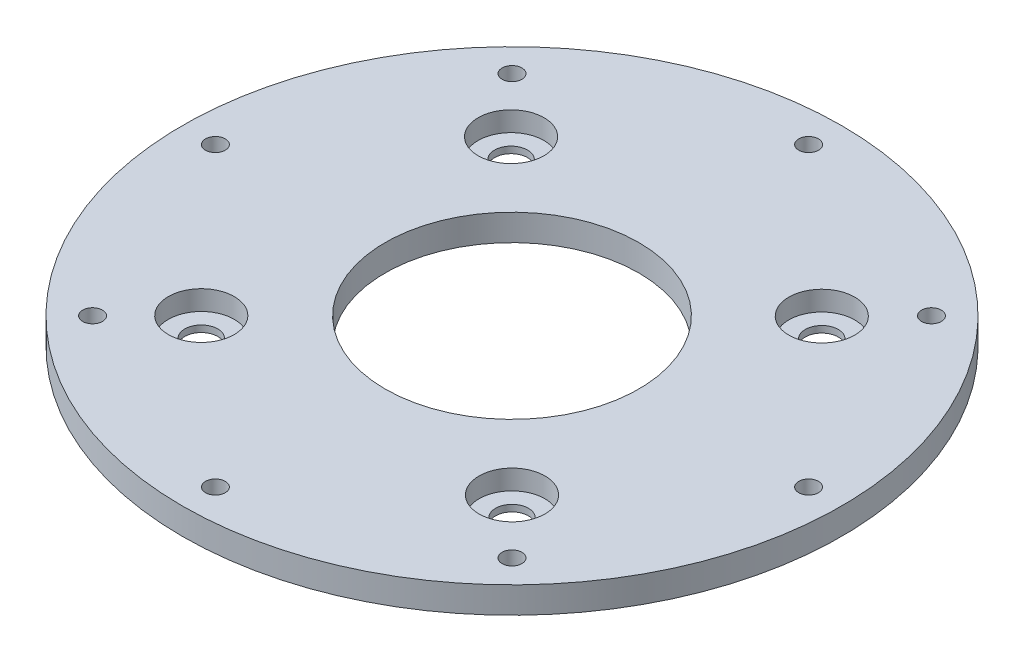
ISO-10303-21;
HEADER;
FILE_DESCRIPTION(('STEP AP214'),'2;1');
FILE_NAME('part.step','',(''),(''),'','','');
FILE_SCHEMA(('AUTOMOTIVE_DESIGN { 1 0 10303 214 1 1 1 1 }'));
ENDSEC;
DATA;
#1=APPLICATION_CONTEXT('core data for automotive mechanical design processes');
#2=APPLICATION_PROTOCOL_DEFINITION('international standard','automotive_design',2000,#1);
#3=PRODUCT_CONTEXT('',#1,'mechanical');
#4=PRODUCT('Part','Part','',(#3));
#5=PRODUCT_RELATED_PRODUCT_CATEGORY('part','',(#4));
#6=PRODUCT_DEFINITION_FORMATION('','',#4);
#7=PRODUCT_DEFINITION_CONTEXT('part definition',#1,'design');
#8=PRODUCT_DEFINITION('design','',#6,#7);
#9=PRODUCT_DEFINITION_SHAPE('','',#8);
#10=(LENGTH_UNIT() NAMED_UNIT(*) SI_UNIT(.MILLI.,.METRE.));
#11=(NAMED_UNIT(*) PLANE_ANGLE_UNIT() SI_UNIT($,.RADIAN.));
#12=(NAMED_UNIT(*) SI_UNIT($,.STERADIAN.) SOLID_ANGLE_UNIT());
#13=UNCERTAINTY_MEASURE_WITH_UNIT(LENGTH_MEASURE(1.E-05),#10,'distance_accuracy_value','');
#14=(GEOMETRIC_REPRESENTATION_CONTEXT(3) GLOBAL_UNCERTAINTY_ASSIGNED_CONTEXT((#13)) GLOBAL_UNIT_ASSIGNED_CONTEXT((#10,
#11,#12)) REPRESENTATION_CONTEXT('',''));
#15=CARTESIAN_POINT('',(0.,0.,0.));
#16=DIRECTION('',(0.,0.,1.));
#17=DIRECTION('',(1.,0.,0.));
#18=AXIS2_PLACEMENT_3D('',#15,#16,#17);
#19=CARTESIAN_POINT('',(23.5424997013851,81.0000000000003,28.5417867616985));
#20=DIRECTION('',(0.,1.,0.));
#21=DIRECTION('',(0.,0.,1.));
#22=AXIS2_PLACEMENT_3D('',#19,#20,#21);
#23=CYLINDRICAL_SURFACE('',#22,5.);
#24=CARTESIAN_POINT('',(23.5424997013851,64.0000000000003,28.5417867616985));
#25=DIRECTION('',(0.,1.,0.));
#26=DIRECTION('',(0.,0.,1.));
#27=AXIS2_PLACEMENT_3D('',#24,#25,#26);
#28=CIRCLE('',#27,5.);
#29=CARTESIAN_POINT('',(23.5424997013851,64.0000000000003,33.5417867616985));
#30=VERTEX_POINT('',#29);
#31=EDGE_CURVE('E116',#30,#30,#28,.F.);
#32=ORIENTED_EDGE('',*,*,#31,.F.);
#33=EDGE_LOOP('',(#32));
#34=FACE_BOUND('',#33,.T.);
#35=CARTESIAN_POINT('',(23.5424997013851,61.0000000000003,28.5417867616985));
#36=DIRECTION('',(0.,1.,0.));
#37=DIRECTION('',(0.,0.,1.));
#38=AXIS2_PLACEMENT_3D('',#35,#36,#37);
#39=CIRCLE('',#38,5.);
#40=CARTESIAN_POINT('',(23.5424997013851,61.0000000000003,33.5417867616985));
#41=VERTEX_POINT('',#40);
#42=EDGE_CURVE('E18',#41,#41,#39,.T.);
#43=ORIENTED_EDGE('',*,*,#42,.F.);
#44=EDGE_LOOP('',(#43));
#45=FACE_BOUND('',#44,.T.);
#46=ADVANCED_FACE('F15',(#34,#45),#23,.F.);
#47=CARTESIAN_POINT('',(-23.5997520125237,81.0000000000004,28.5417867616985));
#48=DIRECTION('',(0.,1.,0.));
#49=DIRECTION('',(0.,0.,1.));
#50=AXIS2_PLACEMENT_3D('',#47,#48,#49);
#51=CYLINDRICAL_SURFACE('',#50,5.);
#52=CARTESIAN_POINT('',(-23.5997520125237,64.0000000000004,28.5417867616985));
#53=DIRECTION('',(0.,1.,0.));
#54=DIRECTION('',(0.,0.,1.));
#55=AXIS2_PLACEMENT_3D('',#52,#53,#54);
#56=CIRCLE('',#55,5.);
#57=CARTESIAN_POINT('',(-23.5997520125237,64.0000000000004,33.5417867616985));
#58=VERTEX_POINT('',#57);
#59=EDGE_CURVE('E113',#58,#58,#56,.F.);
#60=ORIENTED_EDGE('',*,*,#59,.F.);
#61=EDGE_LOOP('',(#60));
#62=FACE_BOUND('',#61,.T.);
#63=CARTESIAN_POINT('',(-23.5997520125237,61.0000000000004,28.5417867616985));
#64=DIRECTION('',(0.,1.,0.));
#65=DIRECTION('',(0.,0.,1.));
#66=AXIS2_PLACEMENT_3D('',#63,#64,#65);
#67=CIRCLE('',#66,5.);
#68=CARTESIAN_POINT('',(-23.5997520125237,61.0000000000004,33.5417867616985));
#69=VERTEX_POINT('',#68);
#70=EDGE_CURVE('E124',#69,#69,#67,.T.);
#71=ORIENTED_EDGE('',*,*,#70,.F.);
#72=EDGE_LOOP('',(#71));
#73=FACE_BOUND('',#72,.T.);
#74=ADVANCED_FACE('F135',(#62,#73),#51,.F.);
#75=CARTESIAN_POINT('',(-23.5997520125236,81.0000000000005,-18.4582132383015));
#76=DIRECTION('',(0.,1.,0.));
#77=DIRECTION('',(0.,0.,1.));
#78=AXIS2_PLACEMENT_3D('',#75,#76,#77);
#79=CYLINDRICAL_SURFACE('',#78,5.);
#80=CARTESIAN_POINT('',(-23.5997520125236,64.0000000000004,-18.4582132383015));
#81=DIRECTION('',(0.,1.,0.));
#82=DIRECTION('',(0.,0.,1.));
#83=AXIS2_PLACEMENT_3D('',#80,#81,#82);
#84=CIRCLE('',#83,5.);
#85=CARTESIAN_POINT('',(-23.5997520125236,64.0000000000004,-13.4582132383015));
#86=VERTEX_POINT('',#85);
#87=EDGE_CURVE('E110',#86,#86,#84,.F.);
#88=ORIENTED_EDGE('',*,*,#87,.F.);
#89=EDGE_LOOP('',(#88));
#90=FACE_BOUND('',#89,.T.);
#91=CARTESIAN_POINT('',(-23.5997520125236,61.0000000000005,-18.4582132383015));
#92=DIRECTION('',(0.,1.,0.));
#93=DIRECTION('',(0.,0.,1.));
#94=AXIS2_PLACEMENT_3D('',#91,#92,#93);
#95=CIRCLE('',#94,5.);
#96=CARTESIAN_POINT('',(-23.5997520125236,61.0000000000005,-13.4582132383015));
#97=VERTEX_POINT('',#96);
#98=EDGE_CURVE('E122',#97,#97,#95,.T.);
#99=ORIENTED_EDGE('',*,*,#98,.F.);
#100=EDGE_LOOP('',(#99));
#101=FACE_BOUND('',#100,.T.);
#102=ADVANCED_FACE('F141',(#90,#101),#79,.F.);
#103=CARTESIAN_POINT('',(23.542499701385,81.0000000000003,-18.4582132383015));
#104=DIRECTION('',(0.,1.,0.));
#105=DIRECTION('',(0.,0.,1.));
#106=AXIS2_PLACEMENT_3D('',#103,#104,#105);
#107=CYLINDRICAL_SURFACE('',#106,5.);
#108=CARTESIAN_POINT('',(23.542499701385,64.0000000000003,-18.4582132383015));
#109=DIRECTION('',(0.,1.,0.));
#110=DIRECTION('',(0.,0.,1.));
#111=AXIS2_PLACEMENT_3D('',#108,#109,#110);
#112=CIRCLE('',#111,5.);
#113=CARTESIAN_POINT('',(23.542499701385,64.0000000000003,-13.4582132383015));
#114=VERTEX_POINT('',#113);
#115=EDGE_CURVE('E107',#114,#114,#112,.F.);
#116=ORIENTED_EDGE('',*,*,#115,.F.);
#117=EDGE_LOOP('',(#116));
#118=FACE_BOUND('',#117,.T.);
#119=CARTESIAN_POINT('',(23.542499701385,61.0000000000003,-18.4582132383015));
#120=DIRECTION('',(0.,1.,0.));
#121=DIRECTION('',(0.,0.,1.));
#122=AXIS2_PLACEMENT_3D('',#119,#120,#121);
#123=CIRCLE('',#122,5.);
#124=CARTESIAN_POINT('',(23.542499701385,61.0000000000003,-13.4582132383015));
#125=VERTEX_POINT('',#124);
#126=EDGE_CURVE('E119',#125,#125,#123,.T.);
#127=ORIENTED_EDGE('',*,*,#126,.F.);
#128=EDGE_LOOP('',(#127));
#129=FACE_BOUND('',#128,.T.);
#130=ADVANCED_FACE('F224',(#118,#129),#107,.F.);
#131=CARTESIAN_POINT('',(28.6424997013851,61.0000000000003,23.4417867616985));
#132=DIRECTION('',(0.,1.,0.));
#133=DIRECTION('',(0.,0.,1.));
#134=AXIS2_PLACEMENT_3D('',#131,#132,#133);
#135=PLANE('',#134);
#136=ORIENTED_EDGE('',*,*,#42,.T.);
#137=EDGE_LOOP('',(#136));
#138=FACE_BOUND('',#137,.T.);
#139=CARTESIAN_POINT('',(23.5424997013851,61.0000000000003,28.5417867616985));
#140=DIRECTION('',(0.,1.,0.));
#141=DIRECTION('',(0.,0.,1.));
#142=AXIS2_PLACEMENT_3D('',#139,#140,#141);
#143=CIRCLE('',#142,2.5);
#144=CARTESIAN_POINT('',(23.5424997013851,61.0000000000003,31.0417867616985));
#145=VERTEX_POINT('',#144);
#146=EDGE_CURVE('E92',#145,#145,#143,.F.);
#147=ORIENTED_EDGE('',*,*,#146,.T.);
#148=EDGE_LOOP('',(#147));
#149=FACE_BOUND('',#148,.T.);
#150=ADVANCED_FACE('F131',(#138,#149),#135,.T.);
#151=CARTESIAN_POINT('',(-18.4997520125237,61.0000000000004,23.4417867616985));
#152=DIRECTION('',(0.,1.,0.));
#153=DIRECTION('',(0.,0.,1.));
#154=AXIS2_PLACEMENT_3D('',#151,#152,#153);
#155=PLANE('',#154);
#156=ORIENTED_EDGE('',*,*,#70,.T.);
#157=EDGE_LOOP('',(#156));
#158=FACE_BOUND('',#157,.T.);
#159=CARTESIAN_POINT('',(-23.5997520125237,61.0000000000004,28.5417867616985));
#160=DIRECTION('',(0.,1.,0.));
#161=DIRECTION('',(0.,0.,1.));
#162=AXIS2_PLACEMENT_3D('',#159,#160,#161);
#163=CIRCLE('',#162,2.5);
#164=CARTESIAN_POINT('',(-23.5997520125237,61.0000000000004,31.0417867616985));
#165=VERTEX_POINT('',#164);
#166=EDGE_CURVE('E89',#165,#165,#163,.F.);
#167=ORIENTED_EDGE('',*,*,#166,.T.);
#168=EDGE_LOOP('',(#167));
#169=FACE_BOUND('',#168,.T.);
#170=ADVANCED_FACE('F218',(#158,#169),#155,.T.);
#171=CARTESIAN_POINT('',(-18.4997520125236,61.0000000000005,-23.5582132383015));
#172=DIRECTION('',(0.,1.,0.));
#173=DIRECTION('',(0.,0.,1.));
#174=AXIS2_PLACEMENT_3D('',#171,#172,#173);
#175=PLANE('',#174);
#176=ORIENTED_EDGE('',*,*,#98,.T.);
#177=EDGE_LOOP('',(#176));
#178=FACE_BOUND('',#177,.T.);
#179=CARTESIAN_POINT('',(-23.5997520125236,61.0000000000005,-18.4582132383015));
#180=DIRECTION('',(0.,1.,0.));
#181=DIRECTION('',(0.,0.,1.));
#182=AXIS2_PLACEMENT_3D('',#179,#180,#181);
#183=CIRCLE('',#182,2.5);
#184=CARTESIAN_POINT('',(-23.5997520125236,61.0000000000005,-15.9582132383015));
#185=VERTEX_POINT('',#184);
#186=EDGE_CURVE('E83',#185,#185,#183,.F.);
#187=ORIENTED_EDGE('',*,*,#186,.T.);
#188=EDGE_LOOP('',(#187));
#189=FACE_BOUND('',#188,.T.);
#190=ADVANCED_FACE('F214',(#178,#189),#175,.T.);
#191=CARTESIAN_POINT('',(28.642499701385,61.0000000000003,-23.5582132383015));
#192=DIRECTION('',(0.,1.,0.));
#193=DIRECTION('',(0.,0.,1.));
#194=AXIS2_PLACEMENT_3D('',#191,#192,#193);
#195=PLANE('',#194);
#196=ORIENTED_EDGE('',*,*,#126,.T.);
#197=EDGE_LOOP('',(#196));
#198=FACE_BOUND('',#197,.T.);
#199=CARTESIAN_POINT('',(23.542499701385,61.0000000000003,-18.4582132383015));
#200=DIRECTION('',(0.,1.,0.));
#201=DIRECTION('',(0.,0.,1.));
#202=AXIS2_PLACEMENT_3D('',#199,#200,#201);
#203=CIRCLE('',#202,2.5);
#204=CARTESIAN_POINT('',(23.542499701385,61.0000000000003,-15.9582132383015));
#205=VERTEX_POINT('',#204);
#206=EDGE_CURVE('E80',#205,#205,#203,.F.);
#207=ORIENTED_EDGE('',*,*,#206,.T.);
#208=EDGE_LOOP('',(#207));
#209=FACE_BOUND('',#208,.T.);
#210=ADVANCED_FACE('F210',(#198,#209),#195,.T.);
#211=CARTESIAN_POINT('',(50.9999999999999,64.0000000000004,-46.0000000000001));
#212=DIRECTION('',(0.,1.,0.));
#213=DIRECTION('',(0.,0.,1.));
#214=AXIS2_PLACEMENT_3D('',#211,#212,#213);
#215=PLANE('',#214);
#216=CARTESIAN_POINT('',(0.,64.0000000000004,4.99999999999994));
#217=DIRECTION('',(0.,-1.,0.));
#218=DIRECTION('',(0.,0.,-1.));
#219=AXIS2_PLACEMENT_3D('',#216,#217,#218);
#220=CIRCLE('',#219,50.);
#221=CARTESIAN_POINT('',(0.,64.0000000000004,-45.0000000000001));
#222=VERTEX_POINT('',#221);
#223=EDGE_CURVE('E65',#222,#222,#220,.T.);
#224=ORIENTED_EDGE('',*,*,#223,.F.);
#225=EDGE_LOOP('',(#224));
#226=FACE_BOUND('',#225,.T.);
#227=CARTESIAN_POINT('',(0.,64.0000000000004,-40.));
#228=DIRECTION('',(0.,-1.,0.));
#229=DIRECTION('',(0.,0.,-1.));
#230=AXIS2_PLACEMENT_3D('',#227,#228,#229);
#231=CIRCLE('',#230,1.5);
#232=CARTESIAN_POINT('',(0.,64.0000000000004,-41.5));
#233=VERTEX_POINT('',#232);
#234=EDGE_CURVE('E68',#233,#233,#231,.T.);
#235=ORIENTED_EDGE('',*,*,#234,.T.);
#236=EDGE_LOOP('',(#235));
#237=FACE_BOUND('',#236,.T.);
#238=CARTESIAN_POINT('',(-31.8198051533945,64.0000000000004,-26.819805153395));
#239=DIRECTION('',(0.,-1.,0.));
#240=DIRECTION('',(0.,0.,-1.));
#241=AXIS2_PLACEMENT_3D('',#238,#239,#240);
#242=CIRCLE('',#241,1.5);
#243=CARTESIAN_POINT('',(-31.8198051533945,64.0000000000004,-28.319805153395));
#244=VERTEX_POINT('',#243);
#245=EDGE_CURVE('E71',#244,#244,#242,.T.);
#246=ORIENTED_EDGE('',*,*,#245,.T.);
#247=EDGE_LOOP('',(#246));
#248=FACE_BOUND('',#247,.T.);
#249=CARTESIAN_POINT('',(0.,64.0000000000003,50.));
#250=DIRECTION('',(0.,-1.,0.));
#251=DIRECTION('',(0.,0.,-1.));
#252=AXIS2_PLACEMENT_3D('',#249,#250,#251);
#253=CIRCLE('',#252,1.5);
#254=CARTESIAN_POINT('',(0.,64.0000000000003,48.5));
#255=VERTEX_POINT('',#254);
#256=EDGE_CURVE('E74',#255,#255,#253,.T.);
#257=ORIENTED_EDGE('',*,*,#256,.T.);
#258=EDGE_LOOP('',(#257));
#259=FACE_BOUND('',#258,.T.);
#260=CARTESIAN_POINT('',(31.8198051533941,64.0000000000003,36.819805153395));
#261=DIRECTION('',(0.,-1.,0.));
#262=DIRECTION('',(0.,0.,-1.));
#263=AXIS2_PLACEMENT_3D('',#260,#261,#262);
#264=CIRCLE('',#263,1.5);
#265=CARTESIAN_POINT('',(31.8198051533941,64.0000000000003,35.319805153395));
#266=VERTEX_POINT('',#265);
#267=EDGE_CURVE('E77',#266,#266,#264,.T.);
#268=ORIENTED_EDGE('',*,*,#267,.T.);
#269=EDGE_LOOP('',(#268));
#270=FACE_BOUND('',#269,.T.);
#271=ORIENTED_EDGE('',*,*,#115,.T.);
#272=EDGE_LOOP('',(#271));
#273=FACE_BOUND('',#272,.T.);
#274=ORIENTED_EDGE('',*,*,#87,.T.);
#275=EDGE_LOOP('',(#274));
#276=FACE_BOUND('',#275,.T.);
#277=CARTESIAN_POINT('',(0.,64.0000000000004,4.99999999999994));
#278=DIRECTION('',(0.,-1.,0.));
#279=DIRECTION('',(0.,0.,-1.));
#280=AXIS2_PLACEMENT_3D('',#277,#278,#279);
#281=CIRCLE('',#280,19.25);
#282=CARTESIAN_POINT('',(0.,64.0000000000004,-14.2500000000001));
#283=VERTEX_POINT('',#282);
#284=EDGE_CURVE('E86',#283,#283,#281,.T.);
#285=ORIENTED_EDGE('',*,*,#284,.T.);
#286=EDGE_LOOP('',(#285));
#287=FACE_BOUND('',#286,.T.);
#288=ORIENTED_EDGE('',*,*,#59,.T.);
#289=EDGE_LOOP('',(#288));
#290=FACE_BOUND('',#289,.T.);
#291=ORIENTED_EDGE('',*,*,#31,.T.);
#292=EDGE_LOOP('',(#291));
#293=FACE_BOUND('',#292,.T.);
#294=CARTESIAN_POINT('',(45.,64.0000000000003,5.00000000000052));
#295=DIRECTION('',(0.,-1.,0.));
#296=DIRECTION('',(0.,0.,-1.));
#297=AXIS2_PLACEMENT_3D('',#294,#295,#296);
#298=CIRCLE('',#297,1.5);
#299=CARTESIAN_POINT('',(45.,64.0000000000003,3.50000000000052));
#300=VERTEX_POINT('',#299);
#301=EDGE_CURVE('E95',#300,#300,#298,.T.);
#302=ORIENTED_EDGE('',*,*,#301,.T.);
#303=EDGE_LOOP('',(#302));
#304=FACE_BOUND('',#303,.T.);
#305=CARTESIAN_POINT('',(31.8198051533947,64.0000000000004,-26.8198051533945));
#306=DIRECTION('',(0.,-1.,0.));
#307=DIRECTION('',(0.,0.,-1.));
#308=AXIS2_PLACEMENT_3D('',#305,#306,#307);
#309=CIRCLE('',#308,1.5);
#310=CARTESIAN_POINT('',(31.8198051533947,64.0000000000004,-28.3198051533945));
#311=VERTEX_POINT('',#310);
#312=EDGE_CURVE('E98',#311,#311,#309,.T.);
#313=ORIENTED_EDGE('',*,*,#312,.T.);
#314=EDGE_LOOP('',(#313));
#315=FACE_BOUND('',#314,.T.);
#316=CARTESIAN_POINT('',(-31.8198051533952,64.0000000000004,36.8198051533942));
#317=DIRECTION('',(0.,-1.,0.));
#318=DIRECTION('',(0.,0.,-1.));
#319=AXIS2_PLACEMENT_3D('',#316,#317,#318);
#320=CIRCLE('',#319,1.5);
#321=CARTESIAN_POINT('',(-31.8198051533952,64.0000000000004,35.3198051533942));
#322=VERTEX_POINT('',#321);
#323=EDGE_CURVE('E101',#322,#322,#320,.T.);
#324=ORIENTED_EDGE('',*,*,#323,.T.);
#325=EDGE_LOOP('',(#324));
#326=FACE_BOUND('',#325,.T.);
#327=CARTESIAN_POINT('',(-45.0000000000001,64.0000000000004,4.99999999999972));
#328=DIRECTION('',(0.,-1.,0.));
#329=DIRECTION('',(0.,0.,-1.));
#330=AXIS2_PLACEMENT_3D('',#327,#328,#329);
#331=CIRCLE('',#330,1.5);
#332=CARTESIAN_POINT('',(-45.0000000000001,64.0000000000004,3.49999999999972));
#333=VERTEX_POINT('',#332);
#334=EDGE_CURVE('E104',#333,#333,#331,.T.);
#335=ORIENTED_EDGE('',*,*,#334,.T.);
#336=EDGE_LOOP('',(#335));
#337=FACE_BOUND('',#336,.T.);
#338=ADVANCED_FACE('F206',(#226,#237,#248,#259,#270,#273,#276,#287,#290,#293,#304,#315,#326,
#337),#215,.T.);
#339=CARTESIAN_POINT('',(-45.0000000000001,54.0000000000005,4.99999999999972));
#340=DIRECTION('',(0.,-1.,0.));
#341=DIRECTION('',(0.,0.,-1.));
#342=AXIS2_PLACEMENT_3D('',#339,#340,#341);
#343=CYLINDRICAL_SURFACE('',#342,1.5);
#344=ORIENTED_EDGE('',*,*,#334,.F.);
#345=EDGE_LOOP('',(#344));
#346=FACE_BOUND('',#345,.T.);
#347=CARTESIAN_POINT('',(-45.0000000000001,60.0000000000004,4.99999999999972));
#348=DIRECTION('',(0.,-1.,0.));
#349=DIRECTION('',(0.,0.,-1.));
#350=AXIS2_PLACEMENT_3D('',#347,#348,#349);
#351=CIRCLE('',#350,1.5);
#352=CARTESIAN_POINT('',(-45.0000000000001,60.0000000000004,3.49999999999972));
#353=VERTEX_POINT('',#352);
#354=EDGE_CURVE('E62',#353,#353,#351,.F.);
#355=ORIENTED_EDGE('',*,*,#354,.F.);
#356=EDGE_LOOP('',(#355));
#357=FACE_BOUND('',#356,.T.);
#358=ADVANCED_FACE('F202',(#346,#357),#343,.F.);
#359=CARTESIAN_POINT('',(-31.8198051533952,54.0000000000004,36.8198051533942));
#360=DIRECTION('',(0.,-1.,0.));
#361=DIRECTION('',(0.,0.,-1.));
#362=AXIS2_PLACEMENT_3D('',#359,#360,#361);
#363=CYLINDRICAL_SURFACE('',#362,1.5);
#364=ORIENTED_EDGE('',*,*,#323,.F.);
#365=EDGE_LOOP('',(#364));
#366=FACE_BOUND('',#365,.T.);
#367=CARTESIAN_POINT('',(-31.8198051533952,60.0000000000004,36.8198051533942));
#368=DIRECTION('',(0.,-1.,0.));
#369=DIRECTION('',(0.,0.,-1.));
#370=AXIS2_PLACEMENT_3D('',#367,#368,#369);
#371=CIRCLE('',#370,1.5);
#372=CARTESIAN_POINT('',(-31.8198051533952,60.0000000000004,35.3198051533942));
#373=VERTEX_POINT('',#372);
#374=EDGE_CURVE('E59',#373,#373,#371,.F.);
#375=ORIENTED_EDGE('',*,*,#374,.F.);
#376=EDGE_LOOP('',(#375));
#377=FACE_BOUND('',#376,.T.);
#378=ADVANCED_FACE('F198',(#366,#377),#363,.F.);
#379=CARTESIAN_POINT('',(31.8198051533947,54.0000000000005,-26.8198051533945));
#380=DIRECTION('',(0.,-1.,0.));
#381=DIRECTION('',(0.,0.,-1.));
#382=AXIS2_PLACEMENT_3D('',#379,#380,#381);
#383=CYLINDRICAL_SURFACE('',#382,1.5);
#384=ORIENTED_EDGE('',*,*,#312,.F.);
#385=EDGE_LOOP('',(#384));
#386=FACE_BOUND('',#385,.T.);
#387=CARTESIAN_POINT('',(31.8198051533947,60.0000000000004,-26.8198051533945));
#388=DIRECTION('',(0.,-1.,0.));
#389=DIRECTION('',(0.,0.,-1.));
#390=AXIS2_PLACEMENT_3D('',#387,#388,#389);
#391=CIRCLE('',#390,1.5);
#392=CARTESIAN_POINT('',(31.8198051533947,60.0000000000004,-28.3198051533945));
#393=VERTEX_POINT('',#392);
#394=EDGE_CURVE('E56',#393,#393,#391,.F.);
#395=ORIENTED_EDGE('',*,*,#394,.F.);
#396=EDGE_LOOP('',(#395));
#397=FACE_BOUND('',#396,.T.);
#398=ADVANCED_FACE('F194',(#386,#397),#383,.F.);
#399=CARTESIAN_POINT('',(45.,54.0000000000004,5.00000000000052));
#400=DIRECTION('',(0.,-1.,0.));
#401=DIRECTION('',(0.,0.,-1.));
#402=AXIS2_PLACEMENT_3D('',#399,#400,#401);
#403=CYLINDRICAL_SURFACE('',#402,1.5);
#404=ORIENTED_EDGE('',*,*,#301,.F.);
#405=EDGE_LOOP('',(#404));
#406=FACE_BOUND('',#405,.T.);
#407=CARTESIAN_POINT('',(45.,60.0000000000004,5.00000000000052));
#408=DIRECTION('',(0.,-1.,0.));
#409=DIRECTION('',(0.,0.,-1.));
#410=AXIS2_PLACEMENT_3D('',#407,#408,#409);
#411=CIRCLE('',#410,1.5);
#412=CARTESIAN_POINT('',(45.,60.0000000000004,3.50000000000052));
#413=VERTEX_POINT('',#412);
#414=EDGE_CURVE('E53',#413,#413,#411,.F.);
#415=ORIENTED_EDGE('',*,*,#414,.F.);
#416=EDGE_LOOP('',(#415));
#417=FACE_BOUND('',#416,.T.);
#418=ADVANCED_FACE('F190',(#406,#417),#403,.F.);
#419=CARTESIAN_POINT('',(23.5424997013851,75.0000000000003,28.5417867616985));
#420=DIRECTION('',(0.,1.,0.));
#421=DIRECTION('',(0.,0.,1.));
#422=AXIS2_PLACEMENT_3D('',#419,#420,#421);
#423=CYLINDRICAL_SURFACE('',#422,2.5);
#424=CARTESIAN_POINT('',(23.5424997013851,60.0000000000004,28.5417867616985));
#425=DIRECTION('',(0.,1.,0.));
#426=DIRECTION('',(0.,0.,1.));
#427=AXIS2_PLACEMENT_3D('',#424,#425,#426);
#428=CIRCLE('',#427,2.5);
#429=CARTESIAN_POINT('',(23.5424997013851,60.0000000000004,31.0417867616985));
#430=VERTEX_POINT('',#429);
#431=EDGE_CURVE('E50',#430,#430,#428,.T.);
#432=ORIENTED_EDGE('',*,*,#431,.F.);
#433=EDGE_LOOP('',(#432));
#434=FACE_BOUND('',#433,.T.);
#435=ORIENTED_EDGE('',*,*,#146,.F.);
#436=EDGE_LOOP('',(#435));
#437=FACE_BOUND('',#436,.T.);
#438=ADVANCED_FACE('F186',(#434,#437),#423,.F.);
#439=CARTESIAN_POINT('',(-23.5997520125237,75.0000000000004,28.5417867616985));
#440=DIRECTION('',(0.,1.,0.));
#441=DIRECTION('',(0.,0.,1.));
#442=AXIS2_PLACEMENT_3D('',#439,#440,#441);
#443=CYLINDRICAL_SURFACE('',#442,2.5);
#444=CARTESIAN_POINT('',(-23.5997520125237,60.0000000000004,28.5417867616985));
#445=DIRECTION('',(0.,1.,0.));
#446=DIRECTION('',(0.,0.,1.));
#447=AXIS2_PLACEMENT_3D('',#444,#445,#446);
#448=CIRCLE('',#447,2.5);
#449=CARTESIAN_POINT('',(-23.5997520125237,60.0000000000004,31.0417867616985));
#450=VERTEX_POINT('',#449);
#451=EDGE_CURVE('E47',#450,#450,#448,.T.);
#452=ORIENTED_EDGE('',*,*,#451,.F.);
#453=EDGE_LOOP('',(#452));
#454=FACE_BOUND('',#453,.T.);
#455=ORIENTED_EDGE('',*,*,#166,.F.);
#456=EDGE_LOOP('',(#455));
#457=FACE_BOUND('',#456,.T.);
#458=ADVANCED_FACE('F182',(#454,#457),#443,.F.);
#459=CARTESIAN_POINT('',(0.,60.0000000000004,4.99999999999994));
#460=DIRECTION('',(0.,-1.,0.));
#461=DIRECTION('',(0.,0.,-1.));
#462=AXIS2_PLACEMENT_3D('',#459,#460,#461);
#463=CYLINDRICAL_SURFACE('',#462,19.25);
#464=CARTESIAN_POINT('',(0.,60.0000000000004,4.99999999999994));
#465=DIRECTION('',(0.,-1.,0.));
#466=DIRECTION('',(0.,0.,-1.));
#467=AXIS2_PLACEMENT_3D('',#464,#465,#466);
#468=CIRCLE('',#467,19.25);
#469=CARTESIAN_POINT('',(0.,60.0000000000004,-14.2500000000001));
#470=VERTEX_POINT('',#469);
#471=EDGE_CURVE('E44',#470,#470,#468,.F.);
#472=ORIENTED_EDGE('',*,*,#471,.F.);
#473=EDGE_LOOP('',(#472));
#474=FACE_BOUND('',#473,.T.);
#475=ORIENTED_EDGE('',*,*,#284,.F.);
#476=EDGE_LOOP('',(#475));
#477=FACE_BOUND('',#476,.T.);
#478=ADVANCED_FACE('F178',(#474,#477),#463,.F.);
#479=CARTESIAN_POINT('',(-23.5997520125236,75.0000000000005,-18.4582132383015));
#480=DIRECTION('',(0.,1.,0.));
#481=DIRECTION('',(0.,0.,1.));
#482=AXIS2_PLACEMENT_3D('',#479,#480,#481);
#483=CYLINDRICAL_SURFACE('',#482,2.5);
#484=CARTESIAN_POINT('',(-23.5997520125236,60.0000000000004,-18.4582132383015));
#485=DIRECTION('',(0.,1.,0.));
#486=DIRECTION('',(0.,0.,1.));
#487=AXIS2_PLACEMENT_3D('',#484,#485,#486);
#488=CIRCLE('',#487,2.5);
#489=CARTESIAN_POINT('',(-23.5997520125236,60.0000000000004,-15.9582132383015));
#490=VERTEX_POINT('',#489);
#491=EDGE_CURVE('E41',#490,#490,#488,.T.);
#492=ORIENTED_EDGE('',*,*,#491,.F.);
#493=EDGE_LOOP('',(#492));
#494=FACE_BOUND('',#493,.T.);
#495=ORIENTED_EDGE('',*,*,#186,.F.);
#496=EDGE_LOOP('',(#495));
#497=FACE_BOUND('',#496,.T.);
#498=ADVANCED_FACE('F174',(#494,#497),#483,.F.);
#499=CARTESIAN_POINT('',(23.542499701385,75.0000000000003,-18.4582132383015));
#500=DIRECTION('',(0.,1.,0.));
#501=DIRECTION('',(0.,0.,1.));
#502=AXIS2_PLACEMENT_3D('',#499,#500,#501);
#503=CYLINDRICAL_SURFACE('',#502,2.5);
#504=CARTESIAN_POINT('',(23.542499701385,60.0000000000004,-18.4582132383015));
#505=DIRECTION('',(0.,1.,0.));
#506=DIRECTION('',(0.,0.,1.));
#507=AXIS2_PLACEMENT_3D('',#504,#505,#506);
#508=CIRCLE('',#507,2.5);
#509=CARTESIAN_POINT('',(23.542499701385,60.0000000000004,-15.9582132383015));
#510=VERTEX_POINT('',#509);
#511=EDGE_CURVE('E38',#510,#510,#508,.T.);
#512=ORIENTED_EDGE('',*,*,#511,.F.);
#513=EDGE_LOOP('',(#512));
#514=FACE_BOUND('',#513,.T.);
#515=ORIENTED_EDGE('',*,*,#206,.F.);
#516=EDGE_LOOP('',(#515));
#517=FACE_BOUND('',#516,.T.);
#518=ADVANCED_FACE('F170',(#514,#517),#503,.F.);
#519=CARTESIAN_POINT('',(31.8198051533941,54.0000000000005,36.819805153395));
#520=DIRECTION('',(0.,-1.,0.));
#521=DIRECTION('',(0.,0.,-1.));
#522=AXIS2_PLACEMENT_3D('',#519,#520,#521);
#523=CYLINDRICAL_SURFACE('',#522,1.5);
#524=ORIENTED_EDGE('',*,*,#267,.F.);
#525=EDGE_LOOP('',(#524));
#526=FACE_BOUND('',#525,.T.);
#527=CARTESIAN_POINT('',(31.8198051533941,60.0000000000004,36.819805153395));
#528=DIRECTION('',(0.,-1.,0.));
#529=DIRECTION('',(0.,0.,-1.));
#530=AXIS2_PLACEMENT_3D('',#527,#528,#529);
#531=CIRCLE('',#530,1.5);
#532=CARTESIAN_POINT('',(31.8198051533941,60.0000000000004,35.319805153395));
#533=VERTEX_POINT('',#532);
#534=EDGE_CURVE('E35',#533,#533,#531,.F.);
#535=ORIENTED_EDGE('',*,*,#534,.F.);
#536=EDGE_LOOP('',(#535));
#537=FACE_BOUND('',#536,.T.);
#538=ADVANCED_FACE('F166',(#526,#537),#523,.F.);
#539=CARTESIAN_POINT('',(0.,54.0000000000004,50.));
#540=DIRECTION('',(0.,-1.,0.));
#541=DIRECTION('',(0.,0.,-1.));
#542=AXIS2_PLACEMENT_3D('',#539,#540,#541);
#543=CYLINDRICAL_SURFACE('',#542,1.5);
#544=ORIENTED_EDGE('',*,*,#256,.F.);
#545=EDGE_LOOP('',(#544));
#546=FACE_BOUND('',#545,.T.);
#547=CARTESIAN_POINT('',(0.,60.0000000000004,50.));
#548=DIRECTION('',(0.,-1.,0.));
#549=DIRECTION('',(0.,0.,-1.));
#550=AXIS2_PLACEMENT_3D('',#547,#548,#549);
#551=CIRCLE('',#550,1.5);
#552=CARTESIAN_POINT('',(0.,60.0000000000004,48.5));
#553=VERTEX_POINT('',#552);
#554=EDGE_CURVE('E32',#553,#553,#551,.F.);
#555=ORIENTED_EDGE('',*,*,#554,.F.);
#556=EDGE_LOOP('',(#555));
#557=FACE_BOUND('',#556,.T.);
#558=ADVANCED_FACE('F162',(#546,#557),#543,.F.);
#559=CARTESIAN_POINT('',(-31.8198051533945,54.0000000000004,-26.819805153395));
#560=DIRECTION('',(0.,-1.,0.));
#561=DIRECTION('',(0.,0.,-1.));
#562=AXIS2_PLACEMENT_3D('',#559,#560,#561);
#563=CYLINDRICAL_SURFACE('',#562,1.5);
#564=ORIENTED_EDGE('',*,*,#245,.F.);
#565=EDGE_LOOP('',(#564));
#566=FACE_BOUND('',#565,.T.);
#567=CARTESIAN_POINT('',(-31.8198051533945,60.0000000000004,-26.819805153395));
#568=DIRECTION('',(0.,-1.,0.));
#569=DIRECTION('',(0.,0.,-1.));
#570=AXIS2_PLACEMENT_3D('',#567,#568,#569);
#571=CIRCLE('',#570,1.5);
#572=CARTESIAN_POINT('',(-31.8198051533945,60.0000000000004,-28.319805153395));
#573=VERTEX_POINT('',#572);
#574=EDGE_CURVE('E27',#573,#573,#571,.F.);
#575=ORIENTED_EDGE('',*,*,#574,.F.);
#576=EDGE_LOOP('',(#575));
#577=FACE_BOUND('',#576,.T.);
#578=ADVANCED_FACE('F158',(#566,#577),#563,.F.);
#579=CARTESIAN_POINT('',(0.,54.0000000000005,-40.));
#580=DIRECTION('',(0.,-1.,0.));
#581=DIRECTION('',(0.,0.,-1.));
#582=AXIS2_PLACEMENT_3D('',#579,#580,#581);
#583=CYLINDRICAL_SURFACE('',#582,1.5);
#584=ORIENTED_EDGE('',*,*,#234,.F.);
#585=EDGE_LOOP('',(#584));
#586=FACE_BOUND('',#585,.T.);
#587=CARTESIAN_POINT('',(0.,60.0000000000004,-40.));
#588=DIRECTION('',(0.,-1.,0.));
#589=DIRECTION('',(0.,0.,-1.));
#590=AXIS2_PLACEMENT_3D('',#587,#588,#589);
#591=CIRCLE('',#590,1.5);
#592=CARTESIAN_POINT('',(0.,60.0000000000004,-41.5));
#593=VERTEX_POINT('',#592);
#594=EDGE_CURVE('E22',#593,#593,#591,.F.);
#595=ORIENTED_EDGE('',*,*,#594,.F.);
#596=EDGE_LOOP('',(#595));
#597=FACE_BOUND('',#596,.T.);
#598=ADVANCED_FACE('F151',(#586,#597),#583,.F.);
#599=CARTESIAN_POINT('',(0.,64.0000000000004,4.99999999999994));
#600=DIRECTION('',(0.,-1.,0.));
#601=DIRECTION('',(0.,0.,-1.));
#602=AXIS2_PLACEMENT_3D('',#599,#600,#601);
#603=CYLINDRICAL_SURFACE('',#602,50.);
#604=ORIENTED_EDGE('',*,*,#223,.T.);
#605=EDGE_LOOP('',(#604));
#606=FACE_BOUND('',#605,.T.);
#607=CARTESIAN_POINT('',(0.,60.0000000000004,4.99999999999994));
#608=DIRECTION('',(0.,-1.,0.));
#609=DIRECTION('',(0.,0.,-1.));
#610=AXIS2_PLACEMENT_3D('',#607,#608,#609);
#611=CIRCLE('',#610,50.);
#612=CARTESIAN_POINT('',(0.,60.0000000000004,-45.0000000000001));
#613=VERTEX_POINT('',#612);
#614=EDGE_CURVE('E10',#613,#613,#611,.T.);
#615=ORIENTED_EDGE('',*,*,#614,.F.);
#616=EDGE_LOOP('',(#615));
#617=FACE_BOUND('',#616,.T.);
#618=ADVANCED_FACE('F146',(#606,#617),#603,.T.);
#619=CARTESIAN_POINT('',(-51.0000000000001,60.0000000000004,-46.));
#620=DIRECTION('',(0.,-1.,0.));
#621=DIRECTION('',(0.,0.,-1.));
#622=AXIS2_PLACEMENT_3D('',#619,#620,#621);
#623=PLANE('',#622);
#624=ORIENTED_EDGE('',*,*,#614,.T.);
#625=EDGE_LOOP('',(#624));
#626=FACE_BOUND('',#625,.T.);
#627=ORIENTED_EDGE('',*,*,#594,.T.);
#628=EDGE_LOOP('',(#627));
#629=FACE_BOUND('',#628,.T.);
#630=ORIENTED_EDGE('',*,*,#574,.T.);
#631=EDGE_LOOP('',(#630));
#632=FACE_BOUND('',#631,.T.);
#633=ORIENTED_EDGE('',*,*,#554,.T.);
#634=EDGE_LOOP('',(#633));
#635=FACE_BOUND('',#634,.T.);
#636=ORIENTED_EDGE('',*,*,#534,.T.);
#637=EDGE_LOOP('',(#636));
#638=FACE_BOUND('',#637,.T.);
#639=ORIENTED_EDGE('',*,*,#511,.T.);
#640=EDGE_LOOP('',(#639));
#641=FACE_BOUND('',#640,.T.);
#642=ORIENTED_EDGE('',*,*,#491,.T.);
#643=EDGE_LOOP('',(#642));
#644=FACE_BOUND('',#643,.T.);
#645=ORIENTED_EDGE('',*,*,#471,.T.);
#646=EDGE_LOOP('',(#645));
#647=FACE_BOUND('',#646,.T.);
#648=ORIENTED_EDGE('',*,*,#451,.T.);
#649=EDGE_LOOP('',(#648));
#650=FACE_BOUND('',#649,.T.);
#651=ORIENTED_EDGE('',*,*,#431,.T.);
#652=EDGE_LOOP('',(#651));
#653=FACE_BOUND('',#652,.T.);
#654=ORIENTED_EDGE('',*,*,#414,.T.);
#655=EDGE_LOOP('',(#654));
#656=FACE_BOUND('',#655,.T.);
#657=ORIENTED_EDGE('',*,*,#394,.T.);
#658=EDGE_LOOP('',(#657));
#659=FACE_BOUND('',#658,.T.);
#660=ORIENTED_EDGE('',*,*,#374,.T.);
#661=EDGE_LOOP('',(#660));
#662=FACE_BOUND('',#661,.T.);
#663=ORIENTED_EDGE('',*,*,#354,.T.);
#664=EDGE_LOOP('',(#663));
#665=FACE_BOUND('',#664,.T.);
#666=ADVANCED_FACE('F144',(#626,#629,#632,#635,#638,#641,#644,#647,#650,#653,#656,#659,#662,
#665),#623,.T.);
#667=CLOSED_SHELL('',(#46,#74,#102,#130,#150,#170,#190,#210,#338,#358,#378,#398,#418,#438,#458,
#478,#498,#518,#538,#558,#578,#598,#618,#666));
#668=MANIFOLD_SOLID_BREP('B1',#667);
#669=ADVANCED_BREP_SHAPE_REPRESENTATION('',(#18,#668),#14);
#670=SHAPE_DEFINITION_REPRESENTATION(#9,#669);
ENDSEC;
END-ISO-10303-21;
